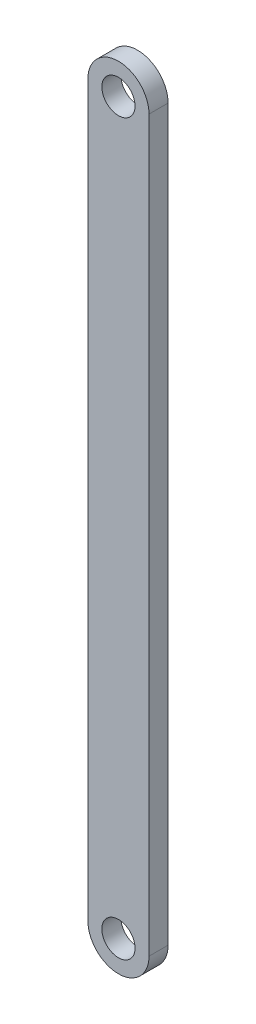
ISO-10303-21;
HEADER;
FILE_DESCRIPTION(('STEP AP214'),'2;1');
FILE_NAME('part.step','',(''),(''),'','','');
FILE_SCHEMA(('AUTOMOTIVE_DESIGN { 1 0 10303 214 1 1 1 1 }'));
ENDSEC;
DATA;
#1=APPLICATION_CONTEXT('core data for automotive mechanical design processes');
#2=APPLICATION_PROTOCOL_DEFINITION('international standard','automotive_design',2000,#1);
#3=PRODUCT_CONTEXT('',#1,'mechanical');
#4=PRODUCT('Part','Part','',(#3));
#5=PRODUCT_RELATED_PRODUCT_CATEGORY('part','',(#4));
#6=PRODUCT_DEFINITION_FORMATION('','',#4);
#7=PRODUCT_DEFINITION_CONTEXT('part definition',#1,'design');
#8=PRODUCT_DEFINITION('design','',#6,#7);
#9=PRODUCT_DEFINITION_SHAPE('','',#8);
#10=(LENGTH_UNIT() NAMED_UNIT(*) SI_UNIT(.MILLI.,.METRE.));
#11=(NAMED_UNIT(*) PLANE_ANGLE_UNIT() SI_UNIT($,.RADIAN.));
#12=(NAMED_UNIT(*) SI_UNIT($,.STERADIAN.) SOLID_ANGLE_UNIT());
#13=UNCERTAINTY_MEASURE_WITH_UNIT(LENGTH_MEASURE(1.E-05),#10,'distance_accuracy_value','');
#14=(GEOMETRIC_REPRESENTATION_CONTEXT(3) GLOBAL_UNCERTAINTY_ASSIGNED_CONTEXT((#13)) GLOBAL_UNIT_ASSIGNED_CONTEXT((#10,
#11,#12)) REPRESENTATION_CONTEXT('',''));
#15=CARTESIAN_POINT('',(0.,0.,0.));
#16=DIRECTION('',(0.,0.,1.));
#17=DIRECTION('',(1.,0.,0.));
#18=AXIS2_PLACEMENT_3D('',#15,#16,#17);
#19=CARTESIAN_POINT('',(0.,0.,5.));
#20=DIRECTION('',(0.,0.,1.));
#21=DIRECTION('',(1.,0.,0.));
#22=AXIS2_PLACEMENT_3D('',#19,#20,#21);
#23=PLANE('',#22);
#24=CARTESIAN_POINT('',(0.,191.,5.));
#25=DIRECTION('',(0.,0.,1.));
#26=DIRECTION('',(1.,0.,0.));
#27=AXIS2_PLACEMENT_3D('',#24,#25,#26);
#28=CIRCLE('',#27,4.35);
#29=CARTESIAN_POINT('',(4.35,191.,5.));
#30=VERTEX_POINT('',#29);
#31=EDGE_CURVE('E103',#30,#30,#28,.T.);
#32=ORIENTED_EDGE('',*,*,#31,.F.);
#33=EDGE_LOOP('',(#32));
#34=FACE_BOUND('',#33,.T.);
#35=CARTESIAN_POINT('',(0.,0.,5.));
#36=DIRECTION('',(0.,0.,1.));
#37=DIRECTION('',(1.,0.,0.));
#38=AXIS2_PLACEMENT_3D('',#35,#36,#37);
#39=CIRCLE('',#38,8.);
#40=CARTESIAN_POINT('',(-8.,0.,5.));
#41=VERTEX_POINT('',#40);
#42=CARTESIAN_POINT('',(8.,0.,5.));
#43=VERTEX_POINT('',#42);
#44=EDGE_CURVE('E88',#41,#43,#39,.T.);
#45=ORIENTED_EDGE('',*,*,#44,.T.);
#46=DIRECTION('',(0.,1.,0.));
#47=VECTOR('',#46,1.);
#48=CARTESIAN_POINT('',(8.,0.,5.));
#49=LINE('',#48,#47);
#50=CARTESIAN_POINT('',(8.,191.,5.));
#51=VERTEX_POINT('',#50);
#52=EDGE_CURVE('E83',#43,#51,#49,.T.);
#53=ORIENTED_EDGE('',*,*,#52,.T.);
#54=CARTESIAN_POINT('',(0.,191.,5.));
#55=DIRECTION('',(0.,0.,1.));
#56=DIRECTION('',(1.,0.,0.));
#57=AXIS2_PLACEMENT_3D('',#54,#55,#56);
#58=CIRCLE('',#57,8.);
#59=CARTESIAN_POINT('',(-8.,191.,5.));
#60=VERTEX_POINT('',#59);
#61=EDGE_CURVE('E86',#51,#60,#58,.T.);
#62=ORIENTED_EDGE('',*,*,#61,.T.);
#63=DIRECTION('',(0.,-1.,0.));
#64=VECTOR('',#63,1.);
#65=CARTESIAN_POINT('',(-8.,0.,5.));
#66=LINE('',#65,#64);
#67=EDGE_CURVE('E53',#60,#41,#66,.T.);
#68=ORIENTED_EDGE('',*,*,#67,.T.);
#69=EDGE_LOOP('',(#45,#53,#62,#68));
#70=FACE_BOUND('',#69,.T.);
#71=CARTESIAN_POINT('',(0.,0.,5.));
#72=DIRECTION('',(0.,0.,1.));
#73=DIRECTION('',(1.,0.,0.));
#74=AXIS2_PLACEMENT_3D('',#71,#72,#73);
#75=CIRCLE('',#74,4.35);
#76=CARTESIAN_POINT('',(4.35,0.,5.));
#77=VERTEX_POINT('',#76);
#78=EDGE_CURVE('E118',#77,#77,#75,.T.);
#79=ORIENTED_EDGE('',*,*,#78,.F.);
#80=EDGE_LOOP('',(#79));
#81=FACE_BOUND('',#80,.T.);
#82=ADVANCED_FACE('F36',(#34,#70,#81),#23,.T.);
#83=CARTESIAN_POINT('',(0.,0.,0.));
#84=DIRECTION('',(0.,0.,1.));
#85=DIRECTION('',(1.,0.,0.));
#86=AXIS2_PLACEMENT_3D('',#83,#84,#85);
#87=PLANE('',#86);
#88=CARTESIAN_POINT('',(0.,0.,0.));
#89=DIRECTION('',(0.,0.,1.));
#90=DIRECTION('',(1.,0.,0.));
#91=AXIS2_PLACEMENT_3D('',#88,#89,#90);
#92=CIRCLE('',#91,8.);
#93=CARTESIAN_POINT('',(-8.,0.,0.));
#94=VERTEX_POINT('',#93);
#95=CARTESIAN_POINT('',(8.,0.,0.));
#96=VERTEX_POINT('',#95);
#97=EDGE_CURVE('E100',#94,#96,#92,.T.);
#98=ORIENTED_EDGE('',*,*,#97,.F.);
#99=DIRECTION('',(0.,-1.,0.));
#100=VECTOR('',#99,1.);
#101=CARTESIAN_POINT('',(-8.,0.,0.));
#102=LINE('',#101,#100);
#103=CARTESIAN_POINT('',(-8.,191.,0.));
#104=VERTEX_POINT('',#103);
#105=EDGE_CURVE('E76',#104,#94,#102,.T.);
#106=ORIENTED_EDGE('',*,*,#105,.F.);
#107=CARTESIAN_POINT('',(0.,191.,0.));
#108=DIRECTION('',(0.,0.,1.));
#109=DIRECTION('',(1.,0.,0.));
#110=AXIS2_PLACEMENT_3D('',#107,#108,#109);
#111=CIRCLE('',#110,8.);
#112=CARTESIAN_POINT('',(8.,191.,0.));
#113=VERTEX_POINT('',#112);
#114=EDGE_CURVE('E70',#113,#104,#111,.T.);
#115=ORIENTED_EDGE('',*,*,#114,.F.);
#116=DIRECTION('',(0.,1.,0.));
#117=VECTOR('',#116,1.);
#118=CARTESIAN_POINT('',(8.,0.,0.));
#119=LINE('',#118,#117);
#120=EDGE_CURVE('E92',#96,#113,#119,.T.);
#121=ORIENTED_EDGE('',*,*,#120,.F.);
#122=EDGE_LOOP('',(#98,#106,#115,#121));
#123=FACE_BOUND('',#122,.T.);
#124=CARTESIAN_POINT('',(0.,191.,0.));
#125=DIRECTION('',(0.,0.,1.));
#126=DIRECTION('',(1.,0.,0.));
#127=AXIS2_PLACEMENT_3D('',#124,#125,#126);
#128=CIRCLE('',#127,4.35);
#129=CARTESIAN_POINT('',(4.35,191.,0.));
#130=VERTEX_POINT('',#129);
#131=EDGE_CURVE('E115',#130,#130,#128,.T.);
#132=ORIENTED_EDGE('',*,*,#131,.T.);
#133=EDGE_LOOP('',(#132));
#134=FACE_BOUND('',#133,.T.);
#135=CARTESIAN_POINT('',(0.,0.,0.));
#136=DIRECTION('',(0.,0.,1.));
#137=DIRECTION('',(1.,0.,0.));
#138=AXIS2_PLACEMENT_3D('',#135,#136,#137);
#139=CIRCLE('',#138,4.35);
#140=CARTESIAN_POINT('',(4.35,0.,0.));
#141=VERTEX_POINT('',#140);
#142=EDGE_CURVE('E121',#141,#141,#139,.T.);
#143=ORIENTED_EDGE('',*,*,#142,.T.);
#144=EDGE_LOOP('',(#143));
#145=FACE_BOUND('',#144,.T.);
#146=ADVANCED_FACE('F111',(#123,#134,#145),#87,.F.);
#147=CARTESIAN_POINT('',(0.,0.,5.));
#148=DIRECTION('',(0.,0.,-1.));
#149=DIRECTION('',(-1.,0.,0.));
#150=AXIS2_PLACEMENT_3D('',#147,#148,#149);
#151=CYLINDRICAL_SURFACE('',#150,8.);
#152=ORIENTED_EDGE('',*,*,#97,.T.);
#153=DIRECTION('',(0.,0.,-1.));
#154=VECTOR('',#153,1.);
#155=CARTESIAN_POINT('',(8.,0.,5.));
#156=LINE('',#155,#154);
#157=EDGE_CURVE('E11',#43,#96,#156,.T.);
#158=ORIENTED_EDGE('',*,*,#157,.F.);
#159=ORIENTED_EDGE('',*,*,#44,.F.);
#160=DIRECTION('',(0.,0.,-1.));
#161=VECTOR('',#160,1.);
#162=CARTESIAN_POINT('',(-8.,0.,5.));
#163=LINE('',#162,#161);
#164=EDGE_CURVE('E96',#41,#94,#163,.T.);
#165=ORIENTED_EDGE('',*,*,#164,.T.);
#166=EDGE_LOOP('',(#152,#158,#159,#165));
#167=FACE_BOUND('',#166,.T.);
#168=ADVANCED_FACE('F38',(#167),#151,.T.);
#169=CARTESIAN_POINT('',(8.,0.,5.));
#170=DIRECTION('',(-1.,0.,0.));
#171=DIRECTION('',(0.,0.,1.));
#172=AXIS2_PLACEMENT_3D('',#169,#170,#171);
#173=PLANE('',#172);
#174=ORIENTED_EDGE('',*,*,#120,.T.);
#175=DIRECTION('',(0.,0.,-1.));
#176=VECTOR('',#175,1.);
#177=CARTESIAN_POINT('',(8.,191.,5.));
#178=LINE('',#177,#176);
#179=EDGE_CURVE('E45',#51,#113,#178,.T.);
#180=ORIENTED_EDGE('',*,*,#179,.F.);
#181=ORIENTED_EDGE('',*,*,#52,.F.);
#182=ORIENTED_EDGE('',*,*,#157,.T.);
#183=EDGE_LOOP('',(#174,#180,#181,#182));
#184=FACE_BOUND('',#183,.T.);
#185=ADVANCED_FACE('F91',(#184),#173,.F.);
#186=CARTESIAN_POINT('',(0.,191.,5.));
#187=DIRECTION('',(0.,0.,-1.));
#188=DIRECTION('',(-1.,0.,0.));
#189=AXIS2_PLACEMENT_3D('',#186,#187,#188);
#190=CYLINDRICAL_SURFACE('',#189,8.);
#191=ORIENTED_EDGE('',*,*,#114,.T.);
#192=DIRECTION('',(0.,0.,-1.));
#193=VECTOR('',#192,1.);
#194=CARTESIAN_POINT('',(-8.,191.,5.));
#195=LINE('',#194,#193);
#196=EDGE_CURVE('E93',#60,#104,#195,.T.);
#197=ORIENTED_EDGE('',*,*,#196,.F.);
#198=ORIENTED_EDGE('',*,*,#61,.F.);
#199=ORIENTED_EDGE('',*,*,#179,.T.);
#200=EDGE_LOOP('',(#191,#197,#198,#199));
#201=FACE_BOUND('',#200,.T.);
#202=ADVANCED_FACE('F94',(#201),#190,.T.);
#203=CARTESIAN_POINT('',(-8.,0.,5.));
#204=DIRECTION('',(1.,0.,0.));
#205=DIRECTION('',(0.,0.,-1.));
#206=AXIS2_PLACEMENT_3D('',#203,#204,#205);
#207=PLANE('',#206);
#208=ORIENTED_EDGE('',*,*,#105,.T.);
#209=ORIENTED_EDGE('',*,*,#164,.F.);
#210=ORIENTED_EDGE('',*,*,#67,.F.);
#211=ORIENTED_EDGE('',*,*,#196,.T.);
#212=EDGE_LOOP('',(#208,#209,#210,#211));
#213=FACE_BOUND('',#212,.T.);
#214=ADVANCED_FACE('F108',(#213),#207,.F.);
#215=CARTESIAN_POINT('',(0.,191.,5.));
#216=DIRECTION('',(0.,0.,-1.));
#217=DIRECTION('',(-1.,0.,0.));
#218=AXIS2_PLACEMENT_3D('',#215,#216,#217);
#219=CYLINDRICAL_SURFACE('',#218,4.35);
#220=ORIENTED_EDGE('',*,*,#31,.T.);
#221=EDGE_LOOP('',(#220));
#222=FACE_BOUND('',#221,.T.);
#223=ORIENTED_EDGE('',*,*,#131,.F.);
#224=EDGE_LOOP('',(#223));
#225=FACE_BOUND('',#224,.T.);
#226=ADVANCED_FACE('F138',(#222,#225),#219,.F.);
#227=CARTESIAN_POINT('',(0.,0.,5.));
#228=DIRECTION('',(0.,0.,-1.));
#229=DIRECTION('',(-1.,0.,0.));
#230=AXIS2_PLACEMENT_3D('',#227,#228,#229);
#231=CYLINDRICAL_SURFACE('',#230,4.35);
#232=ORIENTED_EDGE('',*,*,#78,.T.);
#233=EDGE_LOOP('',(#232));
#234=FACE_BOUND('',#233,.T.);
#235=ORIENTED_EDGE('',*,*,#142,.F.);
#236=EDGE_LOOP('',(#235));
#237=FACE_BOUND('',#236,.T.);
#238=ADVANCED_FACE('F127',(#234,#237),#231,.F.);
#239=CLOSED_SHELL('',(#82,#146,#168,#185,#202,#214,#226,#238));
#240=MANIFOLD_SOLID_BREP('B2',#239);
#241=ADVANCED_BREP_SHAPE_REPRESENTATION('',(#18,#240),#14);
#242=SHAPE_DEFINITION_REPRESENTATION(#9,#241);
ENDSEC;
END-ISO-10303-21;
